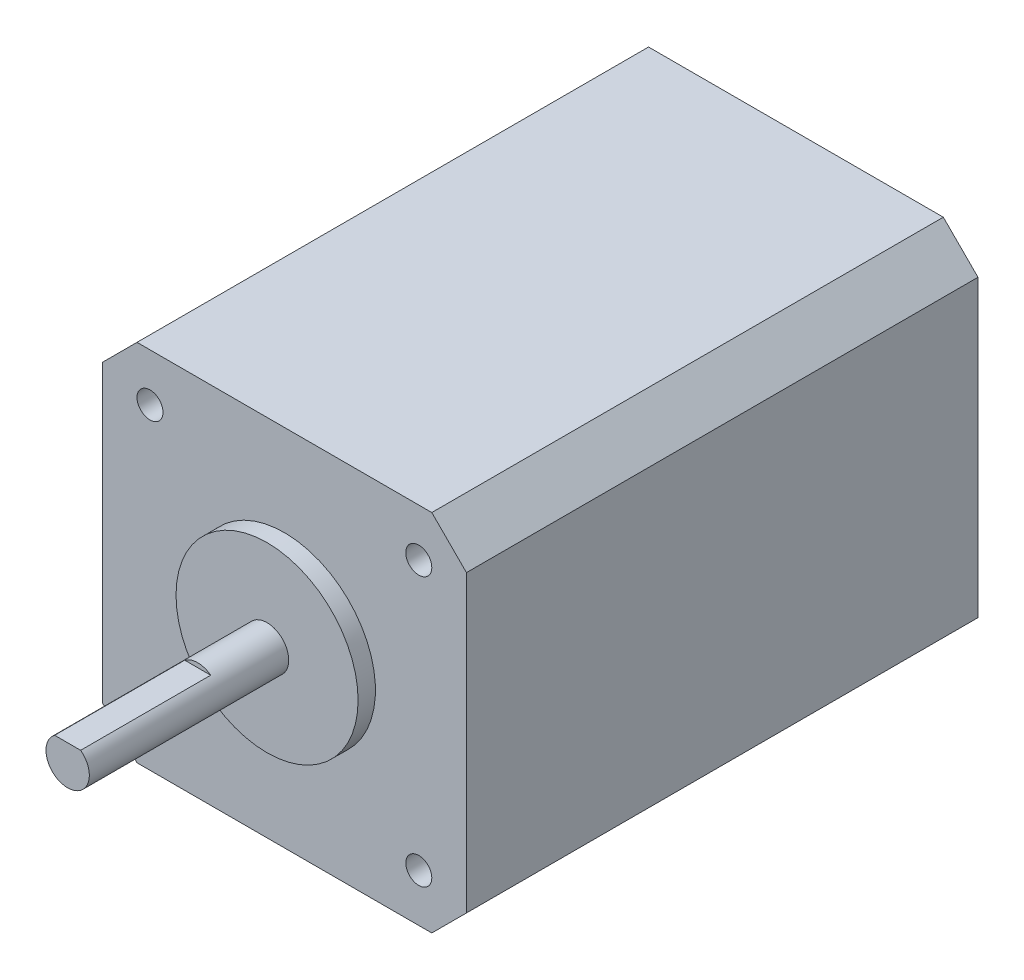
ISO-10303-21;
HEADER;
FILE_DESCRIPTION(('STEP AP214'),'2;1');
FILE_NAME('part.step','',(''),(''),'','','');
FILE_SCHEMA(('AUTOMOTIVE_DESIGN { 1 0 10303 214 1 1 1 1 }'));
ENDSEC;
DATA;
#1=APPLICATION_CONTEXT('core data for automotive mechanical design processes');
#2=APPLICATION_PROTOCOL_DEFINITION('international standard','automotive_design',2000,#1);
#3=PRODUCT_CONTEXT('',#1,'mechanical');
#4=PRODUCT('Part','Part','',(#3));
#5=PRODUCT_RELATED_PRODUCT_CATEGORY('part','',(#4));
#6=PRODUCT_DEFINITION_FORMATION('','',#4);
#7=PRODUCT_DEFINITION_CONTEXT('part definition',#1,'design');
#8=PRODUCT_DEFINITION('design','',#6,#7);
#9=PRODUCT_DEFINITION_SHAPE('','',#8);
#10=(LENGTH_UNIT() NAMED_UNIT(*) SI_UNIT(.MILLI.,.METRE.));
#11=(NAMED_UNIT(*) PLANE_ANGLE_UNIT() SI_UNIT($,.RADIAN.));
#12=(NAMED_UNIT(*) SI_UNIT($,.STERADIAN.) SOLID_ANGLE_UNIT());
#13=UNCERTAINTY_MEASURE_WITH_UNIT(LENGTH_MEASURE(1.E-05),#10,'distance_accuracy_value','');
#14=(GEOMETRIC_REPRESENTATION_CONTEXT(3) GLOBAL_UNCERTAINTY_ASSIGNED_CONTEXT((#13)) GLOBAL_UNIT_ASSIGNED_CONTEXT((#10,
#11,#12)) REPRESENTATION_CONTEXT('',''));
#15=CARTESIAN_POINT('',(0.,0.,0.));
#16=DIRECTION('',(0.,0.,1.));
#17=DIRECTION('',(1.,0.,0.));
#18=AXIS2_PLACEMENT_3D('',#15,#16,#17);
#19=CARTESIAN_POINT('',(0.,0.,59.));
#20=DIRECTION('',(0.,0.,-1.));
#21=DIRECTION('',(-1.,0.,0.));
#22=AXIS2_PLACEMENT_3D('',#19,#20,#21);
#23=PLANE('',#22);
#24=CARTESIAN_POINT('',(0.,0.,59.));
#25=DIRECTION('',(0.,0.,-1.));
#26=DIRECTION('',(-1.,0.,0.));
#27=AXIS2_PLACEMENT_3D('',#24,#25,#26);
#28=CIRCLE('',#27,10.5);
#29=CARTESIAN_POINT('',(-10.5,0.,59.));
#30=VERTEX_POINT('',#29);
#31=EDGE_CURVE('E43',#30,#30,#28,.F.);
#32=ORIENTED_EDGE('',*,*,#31,.F.);
#33=EDGE_LOOP('',(#32));
#34=FACE_BOUND('',#33,.T.);
#35=DIRECTION('',(-0.707106781186548,-0.707106781186548,0.));
#36=VECTOR('',#35,1.);
#37=CARTESIAN_POINT('',(-21.,17.,59.));
#38=LINE('',#37,#36);
#39=CARTESIAN_POINT('',(-17.,21.,59.));
#40=VERTEX_POINT('',#39);
#41=CARTESIAN_POINT('',(-21.,17.,59.));
#42=VERTEX_POINT('',#41);
#43=EDGE_CURVE('E166',#40,#42,#38,.T.);
#44=ORIENTED_EDGE('',*,*,#43,.T.);
#45=DIRECTION('',(0.,-1.,0.));
#46=VECTOR('',#45,1.);
#47=CARTESIAN_POINT('',(-21.,-17.,59.));
#48=LINE('',#47,#46);
#49=CARTESIAN_POINT('',(-21.,-17.,59.));
#50=VERTEX_POINT('',#49);
#51=EDGE_CURVE('E106',#42,#50,#48,.T.);
#52=ORIENTED_EDGE('',*,*,#51,.T.);
#53=DIRECTION('',(0.707106781186548,-0.707106781186548,0.));
#54=VECTOR('',#53,1.);
#55=CARTESIAN_POINT('',(-21.,-17.,59.));
#56=LINE('',#55,#54);
#57=CARTESIAN_POINT('',(-17.,-21.,59.));
#58=VERTEX_POINT('',#57);
#59=EDGE_CURVE('E228',#50,#58,#56,.T.);
#60=ORIENTED_EDGE('',*,*,#59,.T.);
#61=DIRECTION('',(1.,0.,0.));
#62=VECTOR('',#61,1.);
#63=CARTESIAN_POINT('',(-17.,-21.,59.));
#64=LINE('',#63,#62);
#65=CARTESIAN_POINT('',(17.,-21.,59.));
#66=VERTEX_POINT('',#65);
#67=EDGE_CURVE('E234',#58,#66,#64,.T.);
#68=ORIENTED_EDGE('',*,*,#67,.T.);
#69=DIRECTION('',(0.707106781186548,0.707106781186548,0.));
#70=VECTOR('',#69,1.);
#71=CARTESIAN_POINT('',(17.,-21.,59.));
#72=LINE('',#71,#70);
#73=CARTESIAN_POINT('',(21.,-17.,59.));
#74=VERTEX_POINT('',#73);
#75=EDGE_CURVE('E129',#66,#74,#72,.T.);
#76=ORIENTED_EDGE('',*,*,#75,.T.);
#77=DIRECTION('',(0.,1.,0.));
#78=VECTOR('',#77,1.);
#79=CARTESIAN_POINT('',(21.,-17.,59.));
#80=LINE('',#79,#78);
#81=CARTESIAN_POINT('',(21.,17.,59.));
#82=VERTEX_POINT('',#81);
#83=EDGE_CURVE('E122',#74,#82,#80,.T.);
#84=ORIENTED_EDGE('',*,*,#83,.T.);
#85=DIRECTION('',(-0.707106781186548,0.707106781186548,0.));
#86=VECTOR('',#85,1.);
#87=CARTESIAN_POINT('',(17.,21.,59.));
#88=LINE('',#87,#86);
#89=CARTESIAN_POINT('',(17.,21.,59.));
#90=VERTEX_POINT('',#89);
#91=EDGE_CURVE('E126',#82,#90,#88,.T.);
#92=ORIENTED_EDGE('',*,*,#91,.T.);
#93=DIRECTION('',(-1.,0.,0.));
#94=VECTOR('',#93,1.);
#95=CARTESIAN_POINT('',(-17.,21.,59.));
#96=LINE('',#95,#94);
#97=EDGE_CURVE('E64',#90,#40,#96,.T.);
#98=ORIENTED_EDGE('',*,*,#97,.T.);
#99=EDGE_LOOP('',(#44,#52,#60,#68,#76,#84,#92,#98));
#100=FACE_BOUND('',#99,.T.);
#101=CARTESIAN_POINT('',(15.5,15.5,59.));
#102=DIRECTION('',(0.,0.,1.));
#103=DIRECTION('',(1.,0.,0.));
#104=AXIS2_PLACEMENT_3D('',#101,#102,#103);
#105=CIRCLE('',#104,1.5);
#106=CARTESIAN_POINT('',(17.,15.5,59.));
#107=VERTEX_POINT('',#106);
#108=EDGE_CURVE('E154',#107,#107,#105,.T.);
#109=ORIENTED_EDGE('',*,*,#108,.F.);
#110=EDGE_LOOP('',(#109));
#111=FACE_BOUND('',#110,.T.);
#112=CARTESIAN_POINT('',(15.4999999999999,-15.5000000000001,59.));
#113=DIRECTION('',(0.,0.,1.));
#114=DIRECTION('',(1.,0.,0.));
#115=AXIS2_PLACEMENT_3D('',#112,#113,#114);
#116=CIRCLE('',#115,1.5);
#117=CARTESIAN_POINT('',(16.9999999999999,-15.5000000000001,59.));
#118=VERTEX_POINT('',#117);
#119=EDGE_CURVE('E243',#118,#118,#116,.T.);
#120=ORIENTED_EDGE('',*,*,#119,.F.);
#121=EDGE_LOOP('',(#120));
#122=FACE_BOUND('',#121,.T.);
#123=CARTESIAN_POINT('',(-15.5000000000001,-15.4999999999999,59.));
#124=DIRECTION('',(0.,0.,1.));
#125=DIRECTION('',(1.,0.,0.));
#126=AXIS2_PLACEMENT_3D('',#123,#124,#125);
#127=CIRCLE('',#126,1.5);
#128=CARTESIAN_POINT('',(-14.0000000000001,-15.4999999999999,59.));
#129=VERTEX_POINT('',#128);
#130=EDGE_CURVE('E249',#129,#129,#127,.T.);
#131=ORIENTED_EDGE('',*,*,#130,.F.);
#132=EDGE_LOOP('',(#131));
#133=FACE_BOUND('',#132,.T.);
#134=CARTESIAN_POINT('',(-15.4999999999998,15.5000000000002,59.));
#135=DIRECTION('',(0.,0.,1.));
#136=DIRECTION('',(1.,0.,0.));
#137=AXIS2_PLACEMENT_3D('',#134,#135,#136);
#138=CIRCLE('',#137,1.5);
#139=CARTESIAN_POINT('',(-13.9999999999998,15.5000000000002,59.));
#140=VERTEX_POINT('',#139);
#141=EDGE_CURVE('E255',#140,#140,#138,.T.);
#142=ORIENTED_EDGE('',*,*,#141,.F.);
#143=EDGE_LOOP('',(#142));
#144=FACE_BOUND('',#143,.T.);
#145=ADVANCED_FACE('F39',(#34,#100,#111,#122,#133,#144),#23,.F.);
#146=CARTESIAN_POINT('',(0.,0.,0.));
#147=DIRECTION('',(0.,0.,-1.));
#148=DIRECTION('',(-1.,0.,0.));
#149=AXIS2_PLACEMENT_3D('',#146,#147,#148);
#150=PLANE('',#149);
#151=CARTESIAN_POINT('',(-15.5000000000001,-15.4999999999999,0.));
#152=DIRECTION('',(0.,0.,1.));
#153=DIRECTION('',(1.,0.,0.));
#154=AXIS2_PLACEMENT_3D('',#151,#152,#153);
#155=CIRCLE('',#154,1.5);
#156=CARTESIAN_POINT('',(-14.0000000000001,-15.4999999999999,0.));
#157=VERTEX_POINT('',#156);
#158=EDGE_CURVE('E252',#157,#157,#155,.T.);
#159=ORIENTED_EDGE('',*,*,#158,.T.);
#160=EDGE_LOOP('',(#159));
#161=FACE_BOUND('',#160,.T.);
#162=CARTESIAN_POINT('',(15.5,15.5,0.));
#163=DIRECTION('',(0.,0.,1.));
#164=DIRECTION('',(1.,0.,0.));
#165=AXIS2_PLACEMENT_3D('',#162,#163,#164);
#166=CIRCLE('',#165,1.5);
#167=CARTESIAN_POINT('',(17.,15.5,0.));
#168=VERTEX_POINT('',#167);
#169=EDGE_CURVE('E240',#168,#168,#166,.T.);
#170=ORIENTED_EDGE('',*,*,#169,.T.);
#171=EDGE_LOOP('',(#170));
#172=FACE_BOUND('',#171,.T.);
#173=DIRECTION('',(-0.707106781186548,-0.707106781186548,0.));
#174=VECTOR('',#173,1.);
#175=CARTESIAN_POINT('',(-21.,17.,0.));
#176=LINE('',#175,#174);
#177=CARTESIAN_POINT('',(-17.,21.,0.));
#178=VERTEX_POINT('',#177);
#179=CARTESIAN_POINT('',(-21.,17.,0.));
#180=VERTEX_POINT('',#179);
#181=EDGE_CURVE('E150',#178,#180,#176,.T.);
#182=ORIENTED_EDGE('',*,*,#181,.F.);
#183=DIRECTION('',(-1.,0.,0.));
#184=VECTOR('',#183,1.);
#185=CARTESIAN_POINT('',(-17.,21.,0.));
#186=LINE('',#185,#184);
#187=CARTESIAN_POINT('',(17.,21.,0.));
#188=VERTEX_POINT('',#187);
#189=EDGE_CURVE('E97',#188,#178,#186,.T.);
#190=ORIENTED_EDGE('',*,*,#189,.F.);
#191=DIRECTION('',(-0.707106781186548,0.707106781186548,0.));
#192=VECTOR('',#191,1.);
#193=CARTESIAN_POINT('',(17.,21.,0.));
#194=LINE('',#193,#192);
#195=CARTESIAN_POINT('',(21.,17.,0.));
#196=VERTEX_POINT('',#195);
#197=EDGE_CURVE('E163',#196,#188,#194,.T.);
#198=ORIENTED_EDGE('',*,*,#197,.F.);
#199=DIRECTION('',(0.,1.,0.));
#200=VECTOR('',#199,1.);
#201=CARTESIAN_POINT('',(21.,-17.,0.));
#202=LINE('',#201,#200);
#203=CARTESIAN_POINT('',(21.,-17.,0.));
#204=VERTEX_POINT('',#203);
#205=EDGE_CURVE('E138',#204,#196,#202,.T.);
#206=ORIENTED_EDGE('',*,*,#205,.F.);
#207=DIRECTION('',(0.707106781186548,0.707106781186548,0.));
#208=VECTOR('',#207,1.);
#209=CARTESIAN_POINT('',(17.,-21.,0.));
#210=LINE('',#209,#208);
#211=CARTESIAN_POINT('',(17.,-21.,0.));
#212=VERTEX_POINT('',#211);
#213=EDGE_CURVE('E160',#212,#204,#210,.T.);
#214=ORIENTED_EDGE('',*,*,#213,.F.);
#215=DIRECTION('',(1.,0.,0.));
#216=VECTOR('',#215,1.);
#217=CARTESIAN_POINT('',(-17.,-21.,0.));
#218=LINE('',#217,#216);
#219=CARTESIAN_POINT('',(-17.,-21.,0.));
#220=VERTEX_POINT('',#219);
#221=EDGE_CURVE('E158',#220,#212,#218,.T.);
#222=ORIENTED_EDGE('',*,*,#221,.F.);
#223=DIRECTION('',(0.707106781186548,-0.707106781186548,0.));
#224=VECTOR('',#223,1.);
#225=CARTESIAN_POINT('',(-21.,-17.,0.));
#226=LINE('',#225,#224);
#227=CARTESIAN_POINT('',(-21.,-17.,0.));
#228=VERTEX_POINT('',#227);
#229=EDGE_CURVE('E156',#228,#220,#226,.T.);
#230=ORIENTED_EDGE('',*,*,#229,.F.);
#231=DIRECTION('',(0.,-1.,0.));
#232=VECTOR('',#231,1.);
#233=CARTESIAN_POINT('',(-21.,-17.,0.));
#234=LINE('',#233,#232);
#235=EDGE_CURVE('E153',#180,#228,#234,.T.);
#236=ORIENTED_EDGE('',*,*,#235,.F.);
#237=EDGE_LOOP('',(#182,#190,#198,#206,#214,#222,#230,#236));
#238=FACE_BOUND('',#237,.T.);
#239=CARTESIAN_POINT('',(15.4999999999999,-15.5000000000001,0.));
#240=DIRECTION('',(0.,0.,1.));
#241=DIRECTION('',(1.,0.,0.));
#242=AXIS2_PLACEMENT_3D('',#239,#240,#241);
#243=CIRCLE('',#242,1.5);
#244=CARTESIAN_POINT('',(16.9999999999999,-15.5000000000001,0.));
#245=VERTEX_POINT('',#244);
#246=EDGE_CURVE('E246',#245,#245,#243,.T.);
#247=ORIENTED_EDGE('',*,*,#246,.T.);
#248=EDGE_LOOP('',(#247));
#249=FACE_BOUND('',#248,.T.);
#250=CARTESIAN_POINT('',(-15.4999999999998,15.5000000000002,0.));
#251=DIRECTION('',(0.,0.,1.));
#252=DIRECTION('',(1.,0.,0.));
#253=AXIS2_PLACEMENT_3D('',#250,#251,#252);
#254=CIRCLE('',#253,1.5);
#255=CARTESIAN_POINT('',(-13.9999999999998,15.5000000000002,0.));
#256=VERTEX_POINT('',#255);
#257=EDGE_CURVE('E258',#256,#256,#254,.T.);
#258=ORIENTED_EDGE('',*,*,#257,.T.);
#259=EDGE_LOOP('',(#258));
#260=FACE_BOUND('',#259,.T.);
#261=ADVANCED_FACE('F186',(#161,#172,#238,#249,#260),#150,.T.);
#262=CARTESIAN_POINT('',(-21.,17.,59.));
#263=DIRECTION('',(0.707106781186548,-0.707106781186548,0.));
#264=DIRECTION('',(0.707106781186548,0.707106781186548,0.));
#265=AXIS2_PLACEMENT_3D('',#262,#263,#264);
#266=PLANE('',#265);
#267=ORIENTED_EDGE('',*,*,#181,.T.);
#268=DIRECTION('',(0.,0.,-1.));
#269=VECTOR('',#268,1.);
#270=CARTESIAN_POINT('',(-21.,17.,59.));
#271=LINE('',#270,#269);
#272=EDGE_CURVE('E178',#42,#180,#271,.T.);
#273=ORIENTED_EDGE('',*,*,#272,.F.);
#274=ORIENTED_EDGE('',*,*,#43,.F.);
#275=DIRECTION('',(0.,0.,-1.));
#276=VECTOR('',#275,1.);
#277=CARTESIAN_POINT('',(-17.,21.,59.));
#278=LINE('',#277,#276);
#279=EDGE_CURVE('E146',#40,#178,#278,.T.);
#280=ORIENTED_EDGE('',*,*,#279,.T.);
#281=EDGE_LOOP('',(#267,#273,#274,#280));
#282=FACE_BOUND('',#281,.T.);
#283=ADVANCED_FACE('F41',(#282),#266,.F.);
#284=CARTESIAN_POINT('',(-21.,-17.,59.));
#285=DIRECTION('',(1.,0.,0.));
#286=DIRECTION('',(0.,0.,-1.));
#287=AXIS2_PLACEMENT_3D('',#284,#285,#286);
#288=PLANE('',#287);
#289=ORIENTED_EDGE('',*,*,#235,.T.);
#290=DIRECTION('',(0.,0.,-1.));
#291=VECTOR('',#290,1.);
#292=CARTESIAN_POINT('',(-21.,-17.,59.));
#293=LINE('',#292,#291);
#294=EDGE_CURVE('E176',#50,#228,#293,.T.);
#295=ORIENTED_EDGE('',*,*,#294,.F.);
#296=ORIENTED_EDGE('',*,*,#51,.F.);
#297=ORIENTED_EDGE('',*,*,#272,.T.);
#298=EDGE_LOOP('',(#289,#295,#296,#297));
#299=FACE_BOUND('',#298,.T.);
#300=ADVANCED_FACE('F216',(#299),#288,.F.);
#301=CARTESIAN_POINT('',(-21.,-17.,59.));
#302=DIRECTION('',(0.707106781186548,0.707106781186548,0.));
#303=DIRECTION('',(-0.707106781186548,0.707106781186548,0.));
#304=AXIS2_PLACEMENT_3D('',#301,#302,#303);
#305=PLANE('',#304);
#306=ORIENTED_EDGE('',*,*,#229,.T.);
#307=DIRECTION('',(0.,0.,-1.));
#308=VECTOR('',#307,1.);
#309=CARTESIAN_POINT('',(-17.,-21.,59.));
#310=LINE('',#309,#308);
#311=EDGE_CURVE('E173',#58,#220,#310,.T.);
#312=ORIENTED_EDGE('',*,*,#311,.F.);
#313=ORIENTED_EDGE('',*,*,#59,.F.);
#314=ORIENTED_EDGE('',*,*,#294,.T.);
#315=EDGE_LOOP('',(#306,#312,#313,#314));
#316=FACE_BOUND('',#315,.T.);
#317=ADVANCED_FACE('F213',(#316),#305,.F.);
#318=CARTESIAN_POINT('',(-17.,-21.,59.));
#319=DIRECTION('',(0.,1.,0.));
#320=DIRECTION('',(0.,0.,1.));
#321=AXIS2_PLACEMENT_3D('',#318,#319,#320);
#322=PLANE('',#321);
#323=ORIENTED_EDGE('',*,*,#221,.T.);
#324=DIRECTION('',(0.,0.,-1.));
#325=VECTOR('',#324,1.);
#326=CARTESIAN_POINT('',(17.,-21.,59.));
#327=LINE('',#326,#325);
#328=EDGE_CURVE('E170',#66,#212,#327,.T.);
#329=ORIENTED_EDGE('',*,*,#328,.F.);
#330=ORIENTED_EDGE('',*,*,#67,.F.);
#331=ORIENTED_EDGE('',*,*,#311,.T.);
#332=EDGE_LOOP('',(#323,#329,#330,#331));
#333=FACE_BOUND('',#332,.T.);
#334=ADVANCED_FACE('F209',(#333),#322,.F.);
#335=CARTESIAN_POINT('',(17.,-21.,59.));
#336=DIRECTION('',(-0.707106781186548,0.707106781186548,0.));
#337=DIRECTION('',(-0.707106781186548,-0.707106781186548,0.));
#338=AXIS2_PLACEMENT_3D('',#335,#336,#337);
#339=PLANE('',#338);
#340=ORIENTED_EDGE('',*,*,#213,.T.);
#341=DIRECTION('',(0.,0.,-1.));
#342=VECTOR('',#341,1.);
#343=CARTESIAN_POINT('',(21.,-17.,59.));
#344=LINE('',#343,#342);
#345=EDGE_CURVE('E141',#74,#204,#344,.T.);
#346=ORIENTED_EDGE('',*,*,#345,.F.);
#347=ORIENTED_EDGE('',*,*,#75,.F.);
#348=ORIENTED_EDGE('',*,*,#328,.T.);
#349=EDGE_LOOP('',(#340,#346,#347,#348));
#350=FACE_BOUND('',#349,.T.);
#351=ADVANCED_FACE('F206',(#350),#339,.F.);
#352=CARTESIAN_POINT('',(21.,-17.,59.));
#353=DIRECTION('',(-1.,0.,0.));
#354=DIRECTION('',(0.,0.,1.));
#355=AXIS2_PLACEMENT_3D('',#352,#353,#354);
#356=PLANE('',#355);
#357=ORIENTED_EDGE('',*,*,#205,.T.);
#358=DIRECTION('',(0.,0.,-1.));
#359=VECTOR('',#358,1.);
#360=CARTESIAN_POINT('',(21.,17.,59.));
#361=LINE('',#360,#359);
#362=EDGE_CURVE('E135',#82,#196,#361,.T.);
#363=ORIENTED_EDGE('',*,*,#362,.F.);
#364=ORIENTED_EDGE('',*,*,#83,.F.);
#365=ORIENTED_EDGE('',*,*,#345,.T.);
#366=EDGE_LOOP('',(#357,#363,#364,#365));
#367=FACE_BOUND('',#366,.T.);
#368=ADVANCED_FACE('F136',(#367),#356,.F.);
#369=CARTESIAN_POINT('',(17.,21.,59.));
#370=DIRECTION('',(-0.707106781186548,-0.707106781186548,0.));
#371=DIRECTION('',(0.707106781186548,-0.707106781186548,0.));
#372=AXIS2_PLACEMENT_3D('',#369,#370,#371);
#373=PLANE('',#372);
#374=ORIENTED_EDGE('',*,*,#197,.T.);
#375=DIRECTION('',(0.,0.,-1.));
#376=VECTOR('',#375,1.);
#377=CARTESIAN_POINT('',(17.,21.,59.));
#378=LINE('',#377,#376);
#379=EDGE_CURVE('E142',#90,#188,#378,.T.);
#380=ORIENTED_EDGE('',*,*,#379,.F.);
#381=ORIENTED_EDGE('',*,*,#91,.F.);
#382=ORIENTED_EDGE('',*,*,#362,.T.);
#383=EDGE_LOOP('',(#374,#380,#381,#382));
#384=FACE_BOUND('',#383,.T.);
#385=ADVANCED_FACE('F144',(#384),#373,.F.);
#386=CARTESIAN_POINT('',(-17.,21.,59.));
#387=DIRECTION('',(0.,-1.,0.));
#388=DIRECTION('',(0.,0.,-1.));
#389=AXIS2_PLACEMENT_3D('',#386,#387,#388);
#390=PLANE('',#389);
#391=ORIENTED_EDGE('',*,*,#189,.T.);
#392=ORIENTED_EDGE('',*,*,#279,.F.);
#393=ORIENTED_EDGE('',*,*,#97,.F.);
#394=ORIENTED_EDGE('',*,*,#379,.T.);
#395=EDGE_LOOP('',(#391,#392,#393,#394));
#396=FACE_BOUND('',#395,.T.);
#397=ADVANCED_FACE('F199',(#396),#390,.F.);
#398=CARTESIAN_POINT('',(15.5,15.5,59.));
#399=DIRECTION('',(0.,0.,-1.));
#400=DIRECTION('',(-1.,0.,0.));
#401=AXIS2_PLACEMENT_3D('',#398,#399,#400);
#402=CYLINDRICAL_SURFACE('',#401,1.5);
#403=ORIENTED_EDGE('',*,*,#108,.T.);
#404=EDGE_LOOP('',(#403));
#405=FACE_BOUND('',#404,.T.);
#406=ORIENTED_EDGE('',*,*,#169,.F.);
#407=EDGE_LOOP('',(#406));
#408=FACE_BOUND('',#407,.T.);
#409=ADVANCED_FACE('F196',(#405,#408),#402,.F.);
#410=CARTESIAN_POINT('',(15.4999999999999,-15.5000000000001,59.));
#411=DIRECTION('',(0.,0.,-1.));
#412=DIRECTION('',(-1.,0.,0.));
#413=AXIS2_PLACEMENT_3D('',#410,#411,#412);
#414=CYLINDRICAL_SURFACE('',#413,1.5);
#415=ORIENTED_EDGE('',*,*,#119,.T.);
#416=EDGE_LOOP('',(#415));
#417=FACE_BOUND('',#416,.T.);
#418=ORIENTED_EDGE('',*,*,#246,.F.);
#419=EDGE_LOOP('',(#418));
#420=FACE_BOUND('',#419,.T.);
#421=ADVANCED_FACE('F314',(#417,#420),#414,.F.);
#422=CARTESIAN_POINT('',(-15.5000000000001,-15.4999999999999,59.));
#423=DIRECTION('',(0.,0.,-1.));
#424=DIRECTION('',(-1.,0.,0.));
#425=AXIS2_PLACEMENT_3D('',#422,#423,#424);
#426=CYLINDRICAL_SURFACE('',#425,1.5);
#427=ORIENTED_EDGE('',*,*,#130,.T.);
#428=EDGE_LOOP('',(#427));
#429=FACE_BOUND('',#428,.T.);
#430=ORIENTED_EDGE('',*,*,#158,.F.);
#431=EDGE_LOOP('',(#430));
#432=FACE_BOUND('',#431,.T.);
#433=ADVANCED_FACE('F311',(#429,#432),#426,.F.);
#434=CARTESIAN_POINT('',(-15.4999999999998,15.5000000000002,59.));
#435=DIRECTION('',(0.,0.,-1.));
#436=DIRECTION('',(-1.,0.,0.));
#437=AXIS2_PLACEMENT_3D('',#434,#435,#436);
#438=CYLINDRICAL_SURFACE('',#437,1.5);
#439=ORIENTED_EDGE('',*,*,#141,.T.);
#440=EDGE_LOOP('',(#439));
#441=FACE_BOUND('',#440,.T.);
#442=ORIENTED_EDGE('',*,*,#257,.F.);
#443=EDGE_LOOP('',(#442));
#444=FACE_BOUND('',#443,.T.);
#445=ADVANCED_FACE('F308',(#441,#444),#438,.F.);
#446=CARTESIAN_POINT('',(0.,0.,61.));
#447=DIRECTION('',(0.,0.,-1.));
#448=DIRECTION('',(-1.,0.,0.));
#449=AXIS2_PLACEMENT_3D('',#446,#447,#448);
#450=CYLINDRICAL_SURFACE('',#449,10.5);
#451=CARTESIAN_POINT('',(0.,0.,61.));
#452=DIRECTION('',(0.,0.,1.));
#453=DIRECTION('',(1.,0.,0.));
#454=AXIS2_PLACEMENT_3D('',#451,#452,#453);
#455=CIRCLE('',#454,10.5);
#456=CARTESIAN_POINT('',(10.5,0.,61.));
#457=VERTEX_POINT('',#456);
#458=EDGE_CURVE('E261',#457,#457,#455,.T.);
#459=ORIENTED_EDGE('',*,*,#458,.F.);
#460=EDGE_LOOP('',(#459));
#461=FACE_BOUND('',#460,.T.);
#462=ORIENTED_EDGE('',*,*,#31,.T.);
#463=EDGE_LOOP('',(#462));
#464=FACE_BOUND('',#463,.T.);
#465=ADVANCED_FACE('F183',(#461,#464),#450,.T.);
#466=CARTESIAN_POINT('',(0.,0.,61.));
#467=DIRECTION('',(0.,0.,1.));
#468=DIRECTION('',(1.,0.,0.));
#469=AXIS2_PLACEMENT_3D('',#466,#467,#468);
#470=PLANE('',#469);
#471=CARTESIAN_POINT('',(0.,0.,61.));
#472=DIRECTION('',(0.,0.,1.));
#473=DIRECTION('',(1.,0.,0.));
#474=AXIS2_PLACEMENT_3D('',#471,#472,#473);
#475=CIRCLE('',#474,2.5);
#476=CARTESIAN_POINT('',(2.5,0.,61.));
#477=VERTEX_POINT('',#476);
#478=EDGE_CURVE('E11',#477,#477,#475,.T.);
#479=ORIENTED_EDGE('',*,*,#478,.F.);
#480=EDGE_LOOP('',(#479));
#481=FACE_BOUND('',#480,.T.);
#482=ORIENTED_EDGE('',*,*,#458,.T.);
#483=EDGE_LOOP('',(#482));
#484=FACE_BOUND('',#483,.T.);
#485=ADVANCED_FACE('F300',(#481,#484),#470,.T.);
#486=CARTESIAN_POINT('',(0.,0.,84.));
#487=DIRECTION('',(0.,0.,-1.));
#488=DIRECTION('',(-1.,0.,0.));
#489=AXIS2_PLACEMENT_3D('',#486,#487,#488);
#490=CYLINDRICAL_SURFACE('',#489,2.5);
#491=CARTESIAN_POINT('',(0.,0.,84.));
#492=DIRECTION('',(0.,0.,1.));
#493=DIRECTION('',(1.,0.,0.));
#494=AXIS2_PLACEMENT_3D('',#491,#492,#493);
#495=CIRCLE('',#494,2.5);
#496=CARTESIAN_POINT('',(-1.5,2.,84.));
#497=VERTEX_POINT('',#496);
#498=CARTESIAN_POINT('',(1.5,2.,84.));
#499=VERTEX_POINT('',#498);
#500=EDGE_CURVE('E265',#497,#499,#495,.T.);
#501=ORIENTED_EDGE('',*,*,#500,.F.);
#502=DIRECTION('',(0.,0.,1.));
#503=VECTOR('',#502,1.);
#504=CARTESIAN_POINT('',(-1.5,2.,69.));
#505=LINE('',#504,#503);
#506=CARTESIAN_POINT('',(-1.5,2.,69.));
#507=VERTEX_POINT('',#506);
#508=EDGE_CURVE('E55',#507,#497,#505,.T.);
#509=ORIENTED_EDGE('',*,*,#508,.F.);
#510=CARTESIAN_POINT('',(0.,0.,69.));
#511=DIRECTION('',(0.,0.,1.));
#512=DIRECTION('',(1.,0.,0.));
#513=AXIS2_PLACEMENT_3D('',#510,#511,#512);
#514=CIRCLE('',#513,2.5);
#515=CARTESIAN_POINT('',(1.5,2.,69.));
#516=VERTEX_POINT('',#515);
#517=EDGE_CURVE('E276',#516,#507,#514,.T.);
#518=ORIENTED_EDGE('',*,*,#517,.F.);
#519=DIRECTION('',(0.,0.,1.));
#520=VECTOR('',#519,1.);
#521=CARTESIAN_POINT('',(1.5,2.,69.));
#522=LINE('',#521,#520);
#523=EDGE_CURVE('E269',#516,#499,#522,.T.);
#524=ORIENTED_EDGE('',*,*,#523,.T.);
#525=EDGE_LOOP('',(#501,#509,#518,#524));
#526=FACE_BOUND('',#525,.T.);
#527=ORIENTED_EDGE('',*,*,#478,.T.);
#528=EDGE_LOOP('',(#527));
#529=FACE_BOUND('',#528,.T.);
#530=ADVANCED_FACE('F289',(#526,#529),#490,.T.);
#531=CARTESIAN_POINT('',(0.,0.,84.));
#532=DIRECTION('',(0.,0.,1.));
#533=DIRECTION('',(1.,0.,0.));
#534=AXIS2_PLACEMENT_3D('',#531,#532,#533);
#535=PLANE('',#534);
#536=DIRECTION('',(1.,0.,0.));
#537=VECTOR('',#536,1.);
#538=CARTESIAN_POINT('',(0.,2.,84.));
#539=LINE('',#538,#537);
#540=EDGE_CURVE('E274',#497,#499,#539,.T.);
#541=ORIENTED_EDGE('',*,*,#540,.F.);
#542=ORIENTED_EDGE('',*,*,#500,.T.);
#543=EDGE_LOOP('',(#541,#542));
#544=FACE_BOUND('',#543,.T.);
#545=ADVANCED_FACE('F292',(#544),#535,.T.);
#546=CARTESIAN_POINT('',(0.,2.,69.));
#547=DIRECTION('',(0.,-1.,0.));
#548=DIRECTION('',(0.,0.,-1.));
#549=AXIS2_PLACEMENT_3D('',#546,#547,#548);
#550=PLANE('',#549);
#551=ORIENTED_EDGE('',*,*,#540,.T.);
#552=ORIENTED_EDGE('',*,*,#523,.F.);
#553=DIRECTION('',(1.,0.,0.));
#554=VECTOR('',#553,1.);
#555=CARTESIAN_POINT('',(0.,2.,69.));
#556=LINE('',#555,#554);
#557=EDGE_CURVE('E271',#507,#516,#556,.T.);
#558=ORIENTED_EDGE('',*,*,#557,.F.);
#559=ORIENTED_EDGE('',*,*,#508,.T.);
#560=EDGE_LOOP('',(#551,#552,#558,#559));
#561=FACE_BOUND('',#560,.T.);
#562=ADVANCED_FACE('F287',(#561),#550,.F.);
#563=CARTESIAN_POINT('',(0.,0.,69.));
#564=DIRECTION('',(0.,0.,1.));
#565=DIRECTION('',(1.,0.,0.));
#566=AXIS2_PLACEMENT_3D('',#563,#564,#565);
#567=PLANE('',#566);
#568=ORIENTED_EDGE('',*,*,#517,.T.);
#569=ORIENTED_EDGE('',*,*,#557,.T.);
#570=EDGE_LOOP('',(#568,#569));
#571=FACE_BOUND('',#570,.T.);
#572=ADVANCED_FACE('F283',(#571),#567,.T.);
#573=CLOSED_SHELL('',(#145,#261,#283,#300,#317,#334,#351,#368,#385,#397,#409,#421,#433,#445,
#465,#485,#530,#545,#562,#572));
#574=MANIFOLD_SOLID_BREP('B2',#573);
#575=ADVANCED_BREP_SHAPE_REPRESENTATION('',(#18,#574),#14);
#576=SHAPE_DEFINITION_REPRESENTATION(#9,#575);
ENDSEC;
END-ISO-10303-21;
